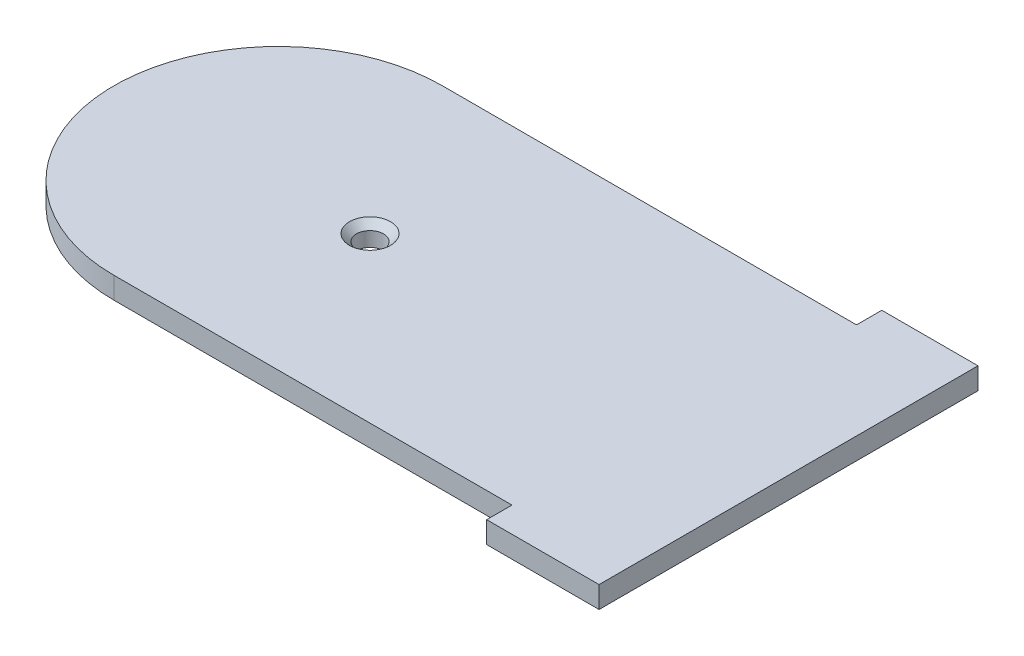
ISO-10303-21;
HEADER;
FILE_DESCRIPTION(('STEP AP214'),'2;1');
FILE_NAME('part.step','',(''),(''),'','','');
FILE_SCHEMA(('AUTOMOTIVE_DESIGN { 1 0 10303 214 1 1 1 1 }'));
ENDSEC;
DATA;
#1=APPLICATION_CONTEXT('core data for automotive mechanical design processes');
#2=APPLICATION_PROTOCOL_DEFINITION('international standard','automotive_design',2000,#1);
#3=PRODUCT_CONTEXT('',#1,'mechanical');
#4=PRODUCT('Part','Part','',(#3));
#5=PRODUCT_RELATED_PRODUCT_CATEGORY('part','',(#4));
#6=PRODUCT_DEFINITION_FORMATION('','',#4);
#7=PRODUCT_DEFINITION_CONTEXT('part definition',#1,'design');
#8=PRODUCT_DEFINITION('design','',#6,#7);
#9=PRODUCT_DEFINITION_SHAPE('','',#8);
#10=(LENGTH_UNIT() NAMED_UNIT(*) SI_UNIT(.MILLI.,.METRE.));
#11=(NAMED_UNIT(*) PLANE_ANGLE_UNIT() SI_UNIT($,.RADIAN.));
#12=(NAMED_UNIT(*) SI_UNIT($,.STERADIAN.) SOLID_ANGLE_UNIT());
#13=UNCERTAINTY_MEASURE_WITH_UNIT(LENGTH_MEASURE(1.E-05),#10,'distance_accuracy_value','');
#14=(GEOMETRIC_REPRESENTATION_CONTEXT(3) GLOBAL_UNCERTAINTY_ASSIGNED_CONTEXT((#13)) GLOBAL_UNIT_ASSIGNED_CONTEXT((#10,
#11,#12)) REPRESENTATION_CONTEXT('',''));
#15=CARTESIAN_POINT('',(0.,0.,0.));
#16=DIRECTION('',(0.,0.,1.));
#17=DIRECTION('',(1.,0.,0.));
#18=AXIS2_PLACEMENT_3D('',#15,#16,#17);
#19=CARTESIAN_POINT('',(8.5,0.,0.));
#20=DIRECTION('',(0.,1.,0.));
#21=DIRECTION('',(0.,0.,1.));
#22=AXIS2_PLACEMENT_3D('',#19,#20,#21);
#23=CYLINDRICAL_SURFACE('',#22,1.25);
#24=CARTESIAN_POINT('',(8.5,0.,0.));
#25=DIRECTION('',(0.,1.,0.));
#26=DIRECTION('',(0.,0.,1.));
#27=AXIS2_PLACEMENT_3D('',#24,#25,#26);
#28=CIRCLE('',#27,1.25);
#29=CARTESIAN_POINT('',(8.5,0.,1.25));
#30=VERTEX_POINT('',#29);
#31=EDGE_CURVE('E145',#30,#30,#28,.T.);
#32=ORIENTED_EDGE('',*,*,#31,.F.);
#33=EDGE_LOOP('',(#32));
#34=FACE_BOUND('',#33,.T.);
#35=CARTESIAN_POINT('',(8.5,1.35000000000001,0.));
#36=DIRECTION('',(0.,1.,0.));
#37=DIRECTION('',(0.,0.,1.));
#38=AXIS2_PLACEMENT_3D('',#35,#36,#37);
#39=CIRCLE('',#38,1.25);
#40=CARTESIAN_POINT('',(8.5,1.35000000000001,1.25));
#41=VERTEX_POINT('',#40);
#42=EDGE_CURVE('E43',#41,#41,#39,.F.);
#43=ORIENTED_EDGE('',*,*,#42,.F.);
#44=EDGE_LOOP('',(#43));
#45=FACE_BOUND('',#44,.T.);
#46=ADVANCED_FACE('F39',(#34,#45),#23,.F.);
#47=CARTESIAN_POINT('',(0.,2.,0.));
#48=DIRECTION('',(0.,-1.,0.));
#49=DIRECTION('',(0.,0.,-1.));
#50=AXIS2_PLACEMENT_3D('',#47,#48,#49);
#51=CYLINDRICAL_SURFACE('',#50,15.19);
#52=CARTESIAN_POINT('',(0.,0.,0.));
#53=DIRECTION('',(0.,1.,0.));
#54=DIRECTION('',(0.,0.,1.));
#55=AXIS2_PLACEMENT_3D('',#52,#53,#54);
#56=CIRCLE('',#55,15.19);
#57=CARTESIAN_POINT('',(0.,0.,-15.19));
#58=VERTEX_POINT('',#57);
#59=CARTESIAN_POINT('',(0.,0.,15.19));
#60=VERTEX_POINT('',#59);
#61=EDGE_CURVE('E142',#58,#60,#56,.T.);
#62=ORIENTED_EDGE('',*,*,#61,.T.);
#63=DIRECTION('',(0.,-1.,0.));
#64=VECTOR('',#63,1.);
#65=CARTESIAN_POINT('',(0.,2.,15.19));
#66=LINE('',#65,#64);
#67=CARTESIAN_POINT('',(0.,2.,15.19));
#68=VERTEX_POINT('',#67);
#69=EDGE_CURVE('E11',#68,#60,#66,.T.);
#70=ORIENTED_EDGE('',*,*,#69,.F.);
#71=CARTESIAN_POINT('',(0.,2.,0.));
#72=DIRECTION('',(0.,1.,0.));
#73=DIRECTION('',(0.,0.,1.));
#74=AXIS2_PLACEMENT_3D('',#71,#72,#73);
#75=CIRCLE('',#74,15.19);
#76=CARTESIAN_POINT('',(0.,2.,-15.19));
#77=VERTEX_POINT('',#76);
#78=EDGE_CURVE('E162',#77,#68,#75,.T.);
#79=ORIENTED_EDGE('',*,*,#78,.F.);
#80=DIRECTION('',(0.,-1.,0.));
#81=VECTOR('',#80,1.);
#82=CARTESIAN_POINT('',(0.,2.,-15.19));
#83=LINE('',#82,#81);
#84=EDGE_CURVE('E57',#77,#58,#83,.T.);
#85=ORIENTED_EDGE('',*,*,#84,.T.);
#86=EDGE_LOOP('',(#62,#70,#79,#85));
#87=FACE_BOUND('',#86,.T.);
#88=ADVANCED_FACE('F41',(#87),#51,.T.);
#89=CARTESIAN_POINT('',(0.,2.,15.19));
#90=DIRECTION('',(0.,0.,-1.));
#91=DIRECTION('',(-1.,0.,0.));
#92=AXIS2_PLACEMENT_3D('',#89,#90,#91);
#93=PLANE('',#92);
#94=DIRECTION('',(1.,0.,0.));
#95=VECTOR('',#94,1.);
#96=CARTESIAN_POINT('',(0.,0.,15.19));
#97=LINE('',#96,#95);
#98=CARTESIAN_POINT('',(36.825,0.,15.19));
#99=VERTEX_POINT('',#98);
#100=EDGE_CURVE('E144',#60,#99,#97,.T.);
#101=ORIENTED_EDGE('',*,*,#100,.T.);
#102=DIRECTION('',(0.,-1.,0.));
#103=VECTOR('',#102,1.);
#104=CARTESIAN_POINT('',(36.825,2.,15.19));
#105=LINE('',#104,#103);
#106=CARTESIAN_POINT('',(36.825,2.,15.19));
#107=VERTEX_POINT('',#106);
#108=EDGE_CURVE('E49',#107,#99,#105,.T.);
#109=ORIENTED_EDGE('',*,*,#108,.F.);
#110=DIRECTION('',(1.,0.,0.));
#111=VECTOR('',#110,1.);
#112=CARTESIAN_POINT('',(0.,2.,15.19));
#113=LINE('',#112,#111);
#114=EDGE_CURVE('E96',#68,#107,#113,.T.);
#115=ORIENTED_EDGE('',*,*,#114,.F.);
#116=ORIENTED_EDGE('',*,*,#69,.T.);
#117=EDGE_LOOP('',(#101,#109,#115,#116));
#118=FACE_BOUND('',#117,.T.);
#119=ADVANCED_FACE('F304',(#118),#93,.F.);
#120=CARTESIAN_POINT('',(36.825,2.,15.19));
#121=DIRECTION('',(1.,0.,0.));
#122=DIRECTION('',(0.,0.,-1.));
#123=AXIS2_PLACEMENT_3D('',#120,#121,#122);
#124=PLANE('',#123);
#125=DIRECTION('',(0.,0.,1.));
#126=VECTOR('',#125,1.);
#127=CARTESIAN_POINT('',(36.825,0.,15.19));
#128=LINE('',#127,#126);
#129=CARTESIAN_POINT('',(36.825,0.,17.5294293));
#130=VERTEX_POINT('',#129);
#131=EDGE_CURVE('E147',#99,#130,#128,.T.);
#132=ORIENTED_EDGE('',*,*,#131,.T.);
#133=DIRECTION('',(0.,-1.,0.));
#134=VECTOR('',#133,1.);
#135=CARTESIAN_POINT('',(36.825,2.,17.5294293));
#136=LINE('',#135,#134);
#137=CARTESIAN_POINT('',(36.825,2.,17.5294293));
#138=VERTEX_POINT('',#137);
#139=EDGE_CURVE('E168',#138,#130,#136,.T.);
#140=ORIENTED_EDGE('',*,*,#139,.F.);
#141=DIRECTION('',(0.,0.,1.));
#142=VECTOR('',#141,1.);
#143=CARTESIAN_POINT('',(36.825,2.,15.19));
#144=LINE('',#143,#142);
#145=EDGE_CURVE('E176',#107,#138,#144,.T.);
#146=ORIENTED_EDGE('',*,*,#145,.F.);
#147=ORIENTED_EDGE('',*,*,#108,.T.);
#148=EDGE_LOOP('',(#132,#140,#146,#147));
#149=FACE_BOUND('',#148,.T.);
#150=ADVANCED_FACE('F174',(#149),#124,.F.);
#151=CARTESIAN_POINT('',(47.225,2.,17.5294293));
#152=DIRECTION('',(0.,0.,1.));
#153=DIRECTION('',(1.,0.,0.));
#154=AXIS2_PLACEMENT_3D('',#151,#152,#153);
#155=PLANE('',#154);
#156=DIRECTION('',(-1.,0.,0.));
#157=VECTOR('',#156,1.);
#158=CARTESIAN_POINT('',(47.225,0.,17.5294293));
#159=LINE('',#158,#157);
#160=CARTESIAN_POINT('',(47.225,0.,17.5294293));
#161=VERTEX_POINT('',#160);
#162=EDGE_CURVE('E150',#161,#130,#159,.T.);
#163=ORIENTED_EDGE('',*,*,#162,.F.);
#164=DIRECTION('',(0.,-1.,0.));
#165=VECTOR('',#164,1.);
#166=CARTESIAN_POINT('',(47.225,2.,17.5294293));
#167=LINE('',#166,#165);
#168=CARTESIAN_POINT('',(47.225,2.,17.5294293));
#169=VERTEX_POINT('',#168);
#170=EDGE_CURVE('E166',#169,#161,#167,.T.);
#171=ORIENTED_EDGE('',*,*,#170,.F.);
#172=DIRECTION('',(-1.,0.,0.));
#173=VECTOR('',#172,1.);
#174=CARTESIAN_POINT('',(47.225,2.,17.5294293));
#175=LINE('',#174,#173);
#176=EDGE_CURVE('E184',#169,#138,#175,.T.);
#177=ORIENTED_EDGE('',*,*,#176,.T.);
#178=ORIENTED_EDGE('',*,*,#139,.T.);
#179=EDGE_LOOP('',(#163,#171,#177,#178));
#180=FACE_BOUND('',#179,.T.);
#181=ADVANCED_FACE('F182',(#180),#155,.T.);
#182=CARTESIAN_POINT('',(47.225,2.,-17.5294293));
#183=DIRECTION('',(1.,0.,0.));
#184=DIRECTION('',(0.,0.,-1.));
#185=AXIS2_PLACEMENT_3D('',#182,#183,#184);
#186=PLANE('',#185);
#187=DIRECTION('',(0.,0.,1.));
#188=VECTOR('',#187,1.);
#189=CARTESIAN_POINT('',(47.225,0.,-17.5294293));
#190=LINE('',#189,#188);
#191=CARTESIAN_POINT('',(47.225,0.,-17.5294293));
#192=VERTEX_POINT('',#191);
#193=EDGE_CURVE('E153',#192,#161,#190,.T.);
#194=ORIENTED_EDGE('',*,*,#193,.F.);
#195=DIRECTION('',(0.,-1.,0.));
#196=VECTOR('',#195,1.);
#197=CARTESIAN_POINT('',(47.225,2.,-17.5294293));
#198=LINE('',#197,#196);
#199=CARTESIAN_POINT('',(47.225,2.,-17.5294293));
#200=VERTEX_POINT('',#199);
#201=EDGE_CURVE('E124',#200,#192,#198,.T.);
#202=ORIENTED_EDGE('',*,*,#201,.F.);
#203=DIRECTION('',(0.,0.,1.));
#204=VECTOR('',#203,1.);
#205=CARTESIAN_POINT('',(47.225,2.,-17.5294293));
#206=LINE('',#205,#204);
#207=EDGE_CURVE('E134',#200,#169,#206,.T.);
#208=ORIENTED_EDGE('',*,*,#207,.T.);
#209=ORIENTED_EDGE('',*,*,#170,.T.);
#210=EDGE_LOOP('',(#194,#202,#208,#209));
#211=FACE_BOUND('',#210,.T.);
#212=ADVANCED_FACE('F297',(#211),#186,.T.);
#213=CARTESIAN_POINT('',(38.325,2.,-17.5294293));
#214=DIRECTION('',(0.,0.,-1.));
#215=DIRECTION('',(-1.,0.,0.));
#216=AXIS2_PLACEMENT_3D('',#213,#214,#215);
#217=PLANE('',#216);
#218=DIRECTION('',(1.,0.,0.));
#219=VECTOR('',#218,1.);
#220=CARTESIAN_POINT('',(38.325,0.,-17.5294293));
#221=LINE('',#220,#219);
#222=CARTESIAN_POINT('',(38.325,0.,-17.5294293));
#223=VERTEX_POINT('',#222);
#224=EDGE_CURVE('E120',#223,#192,#221,.T.);
#225=ORIENTED_EDGE('',*,*,#224,.F.);
#226=DIRECTION('',(0.,-1.,0.));
#227=VECTOR('',#226,1.);
#228=CARTESIAN_POINT('',(38.325,2.,-17.5294293));
#229=LINE('',#228,#227);
#230=CARTESIAN_POINT('',(38.325,2.,-17.5294293));
#231=VERTEX_POINT('',#230);
#232=EDGE_CURVE('E115',#231,#223,#229,.T.);
#233=ORIENTED_EDGE('',*,*,#232,.F.);
#234=DIRECTION('',(1.,0.,0.));
#235=VECTOR('',#234,1.);
#236=CARTESIAN_POINT('',(38.325,2.,-17.5294293));
#237=LINE('',#236,#235);
#238=EDGE_CURVE('E118',#231,#200,#237,.T.);
#239=ORIENTED_EDGE('',*,*,#238,.T.);
#240=ORIENTED_EDGE('',*,*,#201,.T.);
#241=EDGE_LOOP('',(#225,#233,#239,#240));
#242=FACE_BOUND('',#241,.T.);
#243=ADVANCED_FACE('F117',(#242),#217,.T.);
#244=CARTESIAN_POINT('',(38.325,2.,-15.19));
#245=DIRECTION('',(-1.,0.,0.));
#246=DIRECTION('',(0.,0.,1.));
#247=AXIS2_PLACEMENT_3D('',#244,#245,#246);
#248=PLANE('',#247);
#249=DIRECTION('',(0.,0.,-1.));
#250=VECTOR('',#249,1.);
#251=CARTESIAN_POINT('',(38.325,0.,-15.19));
#252=LINE('',#251,#250);
#253=CARTESIAN_POINT('',(38.325,0.,-15.19));
#254=VERTEX_POINT('',#253);
#255=EDGE_CURVE('E157',#254,#223,#252,.T.);
#256=ORIENTED_EDGE('',*,*,#255,.F.);
#257=DIRECTION('',(0.,-1.,0.));
#258=VECTOR('',#257,1.);
#259=CARTESIAN_POINT('',(38.325,2.,-15.19));
#260=LINE('',#259,#258);
#261=CARTESIAN_POINT('',(38.325,2.,-15.19));
#262=VERTEX_POINT('',#261);
#263=EDGE_CURVE('E84',#262,#254,#260,.T.);
#264=ORIENTED_EDGE('',*,*,#263,.F.);
#265=DIRECTION('',(0.,0.,-1.));
#266=VECTOR('',#265,1.);
#267=CARTESIAN_POINT('',(38.325,2.,-15.19));
#268=LINE('',#267,#266);
#269=EDGE_CURVE('E131',#262,#231,#268,.T.);
#270=ORIENTED_EDGE('',*,*,#269,.T.);
#271=ORIENTED_EDGE('',*,*,#232,.T.);
#272=EDGE_LOOP('',(#256,#264,#270,#271));
#273=FACE_BOUND('',#272,.T.);
#274=ADVANCED_FACE('F136',(#273),#248,.T.);
#275=CARTESIAN_POINT('',(0.,2.,-15.19));
#276=DIRECTION('',(0.,0.,-1.));
#277=DIRECTION('',(-1.,0.,0.));
#278=AXIS2_PLACEMENT_3D('',#275,#276,#277);
#279=PLANE('',#278);
#280=DIRECTION('',(1.,0.,0.));
#281=VECTOR('',#280,1.);
#282=CARTESIAN_POINT('',(0.,0.,-15.19));
#283=LINE('',#282,#281);
#284=EDGE_CURVE('E159',#58,#254,#283,.T.);
#285=ORIENTED_EDGE('',*,*,#284,.F.);
#286=ORIENTED_EDGE('',*,*,#84,.F.);
#287=DIRECTION('',(1.,0.,0.));
#288=VECTOR('',#287,1.);
#289=CARTESIAN_POINT('',(0.,2.,-15.19));
#290=LINE('',#289,#288);
#291=EDGE_CURVE('E137',#77,#262,#290,.T.);
#292=ORIENTED_EDGE('',*,*,#291,.T.);
#293=ORIENTED_EDGE('',*,*,#263,.T.);
#294=EDGE_LOOP('',(#285,#286,#292,#293));
#295=FACE_BOUND('',#294,.T.);
#296=ADVANCED_FACE('F288',(#295),#279,.T.);
#297=CARTESIAN_POINT('',(0.,2.,0.));
#298=DIRECTION('',(0.,1.,0.));
#299=DIRECTION('',(0.,0.,1.));
#300=AXIS2_PLACEMENT_3D('',#297,#298,#299);
#301=PLANE('',#300);
#302=CARTESIAN_POINT('',(8.5,2.,0.));
#303=DIRECTION('',(0.,1.,0.));
#304=DIRECTION('',(0.,0.,1.));
#305=AXIS2_PLACEMENT_3D('',#302,#303,#304);
#306=CIRCLE('',#305,1.9);
#307=CARTESIAN_POINT('',(8.5,2.,1.9));
#308=VERTEX_POINT('',#307);
#309=EDGE_CURVE('E192',#308,#308,#306,.T.);
#310=ORIENTED_EDGE('',*,*,#309,.F.);
#311=EDGE_LOOP('',(#310));
#312=FACE_BOUND('',#311,.T.);
#313=ORIENTED_EDGE('',*,*,#78,.T.);
#314=ORIENTED_EDGE('',*,*,#114,.T.);
#315=ORIENTED_EDGE('',*,*,#145,.T.);
#316=ORIENTED_EDGE('',*,*,#176,.F.);
#317=ORIENTED_EDGE('',*,*,#207,.F.);
#318=ORIENTED_EDGE('',*,*,#238,.F.);
#319=ORIENTED_EDGE('',*,*,#269,.F.);
#320=ORIENTED_EDGE('',*,*,#291,.F.);
#321=EDGE_LOOP('',(#313,#314,#315,#316,#317,#318,#319,#320));
#322=FACE_BOUND('',#321,.T.);
#323=ADVANCED_FACE('F129',(#312,#322),#301,.T.);
#324=CARTESIAN_POINT('',(0.,0.,0.));
#325=DIRECTION('',(0.,1.,0.));
#326=DIRECTION('',(0.,0.,1.));
#327=AXIS2_PLACEMENT_3D('',#324,#325,#326);
#328=PLANE('',#327);
#329=DIRECTION('',(0.,0.,1.));
#330=VECTOR('',#329,1.);
#331=CARTESIAN_POINT('',(4.5,0.,-6.5));
#332=LINE('',#331,#330);
#333=CARTESIAN_POINT('',(4.5,0.,-12.0980762113532));
#334=VERTEX_POINT('',#333);
#335=CARTESIAN_POINT('',(4.5,0.,4.5));
#336=VERTEX_POINT('',#335);
#337=EDGE_CURVE('E206',#334,#336,#332,.T.);
#338=ORIENTED_EDGE('',*,*,#337,.F.);
#339=DIRECTION('',(1.,0.,0.));
#340=VECTOR('',#339,1.);
#341=CARTESIAN_POINT('',(-10.2955549577343,0.,-12.0980762113532));
#342=LINE('',#341,#340);
#343=CARTESIAN_POINT('',(-4.5,0.,-12.0980762113532));
#344=VERTEX_POINT('',#343);
#345=EDGE_CURVE('E223',#344,#334,#342,.T.);
#346=ORIENTED_EDGE('',*,*,#345,.F.);
#347=DIRECTION('',(0.,0.,-1.));
#348=VECTOR('',#347,1.);
#349=CARTESIAN_POINT('',(-4.5,0.,-6.5));
#350=LINE('',#349,#348);
#351=CARTESIAN_POINT('',(-4.5,0.,4.5));
#352=VERTEX_POINT('',#351);
#353=EDGE_CURVE('E209',#352,#344,#350,.T.);
#354=ORIENTED_EDGE('',*,*,#353,.F.);
#355=DIRECTION('',(-1.,0.,0.));
#356=VECTOR('',#355,1.);
#357=CARTESIAN_POINT('',(-4.5,0.,4.5));
#358=LINE('',#357,#356);
#359=EDGE_CURVE('E202',#336,#352,#358,.T.);
#360=ORIENTED_EDGE('',*,*,#359,.F.);
#361=EDGE_LOOP('',(#338,#346,#354,#360));
#362=FACE_BOUND('',#361,.T.);
#363=ORIENTED_EDGE('',*,*,#31,.T.);
#364=EDGE_LOOP('',(#363));
#365=FACE_BOUND('',#364,.T.);
#366=ORIENTED_EDGE('',*,*,#61,.F.);
#367=ORIENTED_EDGE('',*,*,#284,.T.);
#368=ORIENTED_EDGE('',*,*,#255,.T.);
#369=ORIENTED_EDGE('',*,*,#224,.T.);
#370=ORIENTED_EDGE('',*,*,#193,.T.);
#371=ORIENTED_EDGE('',*,*,#162,.T.);
#372=ORIENTED_EDGE('',*,*,#131,.F.);
#373=ORIENTED_EDGE('',*,*,#100,.F.);
#374=EDGE_LOOP('',(#366,#367,#368,#369,#370,#371,#372,#373));
#375=FACE_BOUND('',#374,.T.);
#376=ADVANCED_FACE('F178',(#362,#365,#375),#328,.F.);
#377=CARTESIAN_POINT('',(8.5,1.10000000000001,0.));
#378=DIRECTION('',(0.,1.,0.));
#379=DIRECTION('',(0.,0.,1.));
#380=AXIS2_PLACEMENT_3D('',#377,#378,#379);
#381=CONICAL_SURFACE('',#380,1.,0.785398163397454);
#382=ORIENTED_EDGE('',*,*,#309,.T.);
#383=EDGE_LOOP('',(#382));
#384=FACE_BOUND('',#383,.T.);
#385=ORIENTED_EDGE('',*,*,#42,.T.);
#386=EDGE_LOOP('',(#385));
#387=FACE_BOUND('',#386,.T.);
#388=ADVANCED_FACE('F267',(#384,#387),#381,.F.);
#389=CARTESIAN_POINT('',(-4.5,1.5,-6.5));
#390=DIRECTION('',(-1.,0.,0.));
#391=DIRECTION('',(0.,0.,1.));
#392=AXIS2_PLACEMENT_3D('',#389,#390,#391);
#393=PLANE('',#392);
#394=ORIENTED_EDGE('',*,*,#353,.T.);
#395=DIRECTION('',(0.,-0.258819045102525,-0.965925826289067));
#396=VECTOR('',#395,1.);
#397=CARTESIAN_POINT('',(-4.5,1.5,-6.5));
#398=LINE('',#397,#396);
#399=CARTESIAN_POINT('',(-4.5,1.5,-6.5));
#400=VERTEX_POINT('',#399);
#401=EDGE_CURVE('E212',#400,#344,#398,.T.);
#402=ORIENTED_EDGE('',*,*,#401,.F.);
#403=DIRECTION('',(0.,0.,-1.));
#404=VECTOR('',#403,1.);
#405=CARTESIAN_POINT('',(-4.5,1.5,-6.5));
#406=LINE('',#405,#404);
#407=CARTESIAN_POINT('',(-4.5,1.5,4.5));
#408=VERTEX_POINT('',#407);
#409=EDGE_CURVE('E205',#408,#400,#406,.T.);
#410=ORIENTED_EDGE('',*,*,#409,.F.);
#411=DIRECTION('',(0.,-1.,0.));
#412=VECTOR('',#411,1.);
#413=CARTESIAN_POINT('',(-4.5,1.5,4.5));
#414=LINE('',#413,#412);
#415=EDGE_CURVE('E195',#408,#352,#414,.T.);
#416=ORIENTED_EDGE('',*,*,#415,.T.);
#417=EDGE_LOOP('',(#394,#402,#410,#416));
#418=FACE_BOUND('',#417,.T.);
#419=ADVANCED_FACE('F262',(#418),#393,.F.);
#420=CARTESIAN_POINT('',(-4.5,1.5,4.5));
#421=DIRECTION('',(0.,0.,1.));
#422=DIRECTION('',(1.,0.,0.));
#423=AXIS2_PLACEMENT_3D('',#420,#421,#422);
#424=PLANE('',#423);
#425=ORIENTED_EDGE('',*,*,#359,.T.);
#426=ORIENTED_EDGE('',*,*,#415,.F.);
#427=DIRECTION('',(-1.,0.,0.));
#428=VECTOR('',#427,1.);
#429=CARTESIAN_POINT('',(-4.5,1.5,4.5));
#430=LINE('',#429,#428);
#431=CARTESIAN_POINT('',(4.5,1.5,4.5));
#432=VERTEX_POINT('',#431);
#433=EDGE_CURVE('E199',#432,#408,#430,.T.);
#434=ORIENTED_EDGE('',*,*,#433,.F.);
#435=DIRECTION('',(0.,-1.,0.));
#436=VECTOR('',#435,1.);
#437=CARTESIAN_POINT('',(4.5,1.5,4.5));
#438=LINE('',#437,#436);
#439=EDGE_CURVE('E196',#432,#336,#438,.T.);
#440=ORIENTED_EDGE('',*,*,#439,.T.);
#441=EDGE_LOOP('',(#425,#426,#434,#440));
#442=FACE_BOUND('',#441,.T.);
#443=ADVANCED_FACE('F255',(#442),#424,.F.);
#444=CARTESIAN_POINT('',(4.5,1.5,-6.5));
#445=DIRECTION('',(1.,0.,0.));
#446=DIRECTION('',(0.,0.,-1.));
#447=AXIS2_PLACEMENT_3D('',#444,#445,#446);
#448=PLANE('',#447);
#449=ORIENTED_EDGE('',*,*,#337,.T.);
#450=ORIENTED_EDGE('',*,*,#439,.F.);
#451=DIRECTION('',(0.,0.,1.));
#452=VECTOR('',#451,1.);
#453=CARTESIAN_POINT('',(4.5,1.5,-6.5));
#454=LINE('',#453,#452);
#455=CARTESIAN_POINT('',(4.5,1.5,-6.5));
#456=VERTEX_POINT('',#455);
#457=EDGE_CURVE('E215',#456,#432,#454,.T.);
#458=ORIENTED_EDGE('',*,*,#457,.F.);
#459=DIRECTION('',(0.,-0.258819045102525,-0.965925826289067));
#460=VECTOR('',#459,1.);
#461=CARTESIAN_POINT('',(4.5,1.5,-6.5));
#462=LINE('',#461,#460);
#463=EDGE_CURVE('E226',#456,#334,#462,.T.);
#464=ORIENTED_EDGE('',*,*,#463,.T.);
#465=EDGE_LOOP('',(#449,#450,#458,#464));
#466=FACE_BOUND('',#465,.T.);
#467=ADVANCED_FACE('F234',(#466),#448,.F.);
#468=CARTESIAN_POINT('',(0.,1.5,0.));
#469=DIRECTION('',(0.,1.,0.));
#470=DIRECTION('',(0.,0.,1.));
#471=AXIS2_PLACEMENT_3D('',#468,#469,#470);
#472=PLANE('',#471);
#473=ORIENTED_EDGE('',*,*,#409,.T.);
#474=DIRECTION('',(1.,0.,0.));
#475=VECTOR('',#474,1.);
#476=CARTESIAN_POINT('',(-4.5,1.5,-6.5));
#477=LINE('',#476,#475);
#478=EDGE_CURVE('E218',#400,#456,#477,.T.);
#479=ORIENTED_EDGE('',*,*,#478,.T.);
#480=ORIENTED_EDGE('',*,*,#457,.T.);
#481=ORIENTED_EDGE('',*,*,#433,.T.);
#482=EDGE_LOOP('',(#473,#479,#480,#481));
#483=FACE_BOUND('',#482,.T.);
#484=ADVANCED_FACE('F258',(#483),#472,.F.);
#485=CARTESIAN_POINT('',(-10.2955549577343,1.5,-6.5));
#486=DIRECTION('',(0.,-0.965925826289067,0.258819045102525));
#487=DIRECTION('',(0.,-0.258819045102525,-0.965925826289067));
#488=AXIS2_PLACEMENT_3D('',#485,#486,#487);
#489=PLANE('',#488);
#490=ORIENTED_EDGE('',*,*,#401,.T.);
#491=ORIENTED_EDGE('',*,*,#345,.T.);
#492=ORIENTED_EDGE('',*,*,#463,.F.);
#493=ORIENTED_EDGE('',*,*,#478,.F.);
#494=EDGE_LOOP('',(#490,#491,#492,#493));
#495=FACE_BOUND('',#494,.T.);
#496=ADVANCED_FACE('F244',(#495),#489,.T.);
#497=CLOSED_SHELL('',(#46,#88,#119,#150,#181,#212,#243,#274,#296,#323,#376,#388,#419,#443,#467,
#484,#496));
#498=MANIFOLD_SOLID_BREP('B2',#497);
#499=ADVANCED_BREP_SHAPE_REPRESENTATION('',(#18,#498),#14);
#500=SHAPE_DEFINITION_REPRESENTATION(#9,#499);
ENDSEC;
END-ISO-10303-21;
